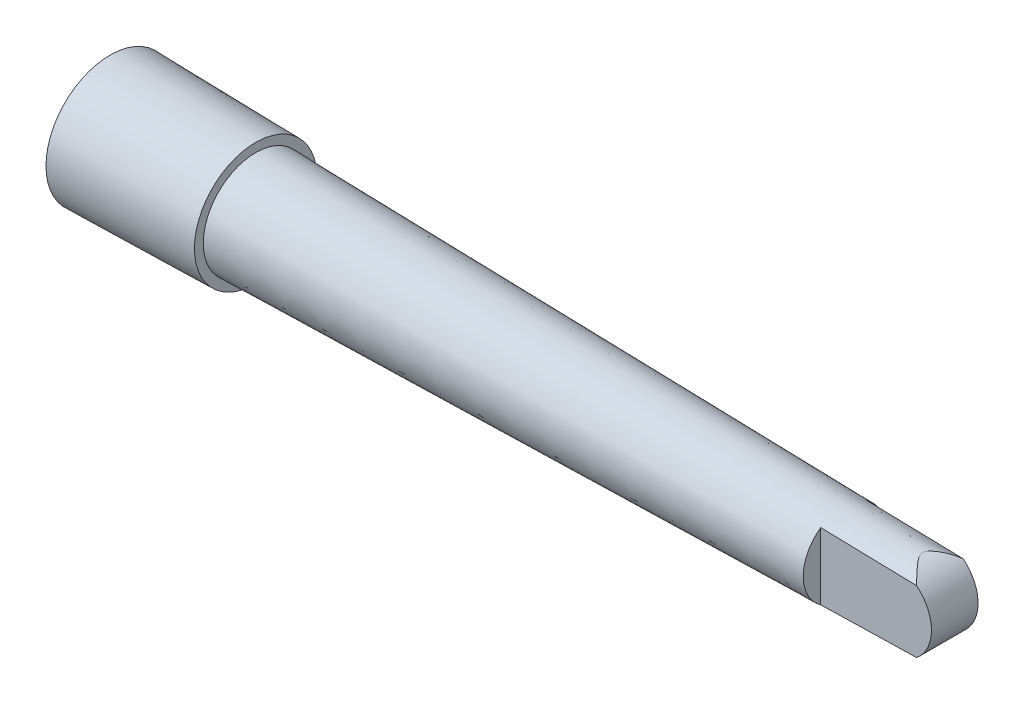
ISO-10303-21;
HEADER;
FILE_DESCRIPTION(('STEP AP214'),'2;1');
FILE_NAME('part.step','',(''),(''),'','','');
FILE_SCHEMA(('AUTOMOTIVE_DESIGN { 1 0 10303 214 1 1 1 1 }'));
ENDSEC;
DATA;
#1=APPLICATION_CONTEXT('core data for automotive mechanical design processes');
#2=APPLICATION_PROTOCOL_DEFINITION('international standard','automotive_design',2000,#1);
#3=PRODUCT_CONTEXT('',#1,'mechanical');
#4=PRODUCT('Part','Part','',(#3));
#5=PRODUCT_RELATED_PRODUCT_CATEGORY('part','',(#4));
#6=PRODUCT_DEFINITION_FORMATION('','',#4);
#7=PRODUCT_DEFINITION_CONTEXT('part definition',#1,'design');
#8=PRODUCT_DEFINITION('design','',#6,#7);
#9=PRODUCT_DEFINITION_SHAPE('','',#8);
#10=(LENGTH_UNIT() NAMED_UNIT(*) SI_UNIT(.MILLI.,.METRE.));
#11=(NAMED_UNIT(*) PLANE_ANGLE_UNIT() SI_UNIT($,.RADIAN.));
#12=(NAMED_UNIT(*) SI_UNIT($,.STERADIAN.) SOLID_ANGLE_UNIT());
#13=UNCERTAINTY_MEASURE_WITH_UNIT(LENGTH_MEASURE(1.E-05),#10,'distance_accuracy_value','');
#14=(GEOMETRIC_REPRESENTATION_CONTEXT(3) GLOBAL_UNCERTAINTY_ASSIGNED_CONTEXT((#13)) GLOBAL_UNIT_ASSIGNED_CONTEXT((#10,
#11,#12)) REPRESENTATION_CONTEXT('',''));
#15=CARTESIAN_POINT('',(0.,0.,0.));
#16=DIRECTION('',(0.,0.,1.));
#17=DIRECTION('',(1.,0.,0.));
#18=AXIS2_PLACEMENT_3D('',#15,#16,#17);
#19=CARTESIAN_POINT('',(34.53891081246,0.,1.));
#20=DIRECTION('',(0.,0.,-1.));
#21=DIRECTION('',(-1.,0.,0.));
#22=AXIS2_PLACEMENT_3D('',#19,#20,#21);
#23=CYLINDRICAL_SURFACE('',#22,1.71381266168101);
#24=CARTESIAN_POINT('',(35.6129098589705,1.33554479050034,1.0002));
#25=CARTESIAN_POINT('',(35.5710754093212,1.36919062556842,0.956614483907782));
#26=CARTESIAN_POINT('',(35.5283537615968,1.40030634566308,0.911972795537945));
#27=CARTESIAN_POINT('',(35.4417156894242,1.45766732781688,0.820693518239143));
#28=CARTESIAN_POINT('',(35.3977985668301,1.4839096707341,0.774054753514446));
#29=CARTESIAN_POINT('',(35.3092679079826,1.53174558296436,0.678807433866155));
#30=CARTESIAN_POINT('',(35.2646526771293,1.55332496296612,0.630193386926654));
#31=CARTESIAN_POINT('',(35.1757037388893,1.59184821556085,0.53095103685445));
#32=CARTESIAN_POINT('',(35.131369855831,1.60879533225182,0.480324171960923));
#33=CARTESIAN_POINT('',(35.063473306734,1.63176892422619,0.398474936995456));
#34=CARTESIAN_POINT('',(35.0391871385938,1.63935547971977,0.368284536236318));
#35=CARTESIAN_POINT('',(34.992060431569,1.65299843700725,0.306373187031664));
#36=CARTESIAN_POINT('',(34.9692210082719,1.65905366850583,0.274651089922352));
#37=CARTESIAN_POINT('',(34.9339233308981,1.66773280757409,0.219748420933613));
#38=CARTESIAN_POINT('',(34.9205424554692,1.67082767945205,0.197245493724769));
#39=CARTESIAN_POINT('',(34.8964783736258,1.67614108434504,0.150732899940423));
#40=CARTESIAN_POINT('',(34.885787015779,1.67836227714266,0.126728068439589));
#41=CARTESIAN_POINT('',(34.8720217201547,1.68113761877454,0.0854390842627665));
#42=CARTESIAN_POINT('',(34.8675937600339,1.68200180191774,0.0686454268782642));
#43=CARTESIAN_POINT('',(34.8615856588943,1.68316511486136,0.0345531090299951));
#44=CARTESIAN_POINT('',(34.8599976165166,1.68346581253088,0.0172559862150024));
#45=CARTESIAN_POINT('',(34.8600023972365,1.68346487787759,-0.0173953252603501));
#46=CARTESIAN_POINT('',(34.8616057710572,1.68316124766568,-0.034749513215745));
#47=CARTESIAN_POINT('',(34.8676613326472,1.6819886959643,-0.0689446489158741));
#48=CARTESIAN_POINT('',(34.8721206167356,1.68111836625907,-0.0857842084108123));
#49=CARTESIAN_POINT('',(34.8870768808451,1.67810105229128,-0.130511061539349));
#50=CARTESIAN_POINT('',(34.8996102641406,1.67548612138437,-0.1576568570613));
#51=CARTESIAN_POINT('',(34.927873045552,1.66915478244201,-0.21013634767005));
#52=CARTESIAN_POINT('',(34.9436207279275,1.66543201446147,-0.235458501449856));
#53=CARTESIAN_POINT('',(34.9931273952503,1.65287029178607,-0.309370873557652));
#54=CARTESIAN_POINT('',(35.029249223681,1.64262083293091,-0.356108818798224));
#55=CARTESIAN_POINT('',(35.1033821698874,1.61866601064454,-0.447181444942085));
#56=CARTESIAN_POINT('',(35.1413976514937,1.60495233740392,-0.491510031176772));
#57=CARTESIAN_POINT('',(35.2179906324063,1.57407302469039,-0.57850019648314));
#58=CARTESIAN_POINT('',(35.2565683498366,1.55690601051195,-0.621161103582338));
#59=CARTESIAN_POINT('',(35.3334917245639,1.51908979930087,-0.705018298709478));
#60=CARTESIAN_POINT('',(35.3718376023505,1.49844474450497,-0.746216259209671));
#61=CARTESIAN_POINT('',(35.4444719564534,1.45558485586137,-0.823571562907206));
#62=CARTESIAN_POINT('',(35.4788147264644,1.43367902982625,-0.859848631999536));
#63=CARTESIAN_POINT('',(35.5465864692199,1.38687928180383,-0.93103780288313));
#64=CARTESIAN_POINT('',(35.5800180207354,1.36199517440583,-0.965953911360827));
#65=CARTESIAN_POINT('',(35.6129098589705,1.33554479050034,-1.0002));
#66=B_SPLINE_CURVE_WITH_KNOTS('',3,(#24,#25,#26,#27,#28,#29,#30,#31,#32,#33,#34,#35,#36,#37,#38,
#39,#40,#41,#42,#43,#44,#45,#46,#47,#48,#49,#50,#51,#52,#53,#54,#55,#56,#57,#58,#59,#60,#61,#62,
#63,#64,#65),.UNSPECIFIED.,.F.,.F.,(4,2,2,2,2,2,2,2,2,2,2,2,2,2,2,2,2,2,2,2,4),(0.,
0.207352947565511,0.414829701257062,0.622929179157062,0.830882543830451,0.949286928779782,
1.06778153119735,1.14677659539275,1.22552927455417,1.27750138874248,1.32932867725505,
1.38132758976482,1.43345621227284,1.52298369100452,1.61303538982849,1.79247034183218,
1.97233987121023,2.15228114522978,2.33200961055955,2.49554542593278,2.65855644388926),.UNSPECIFIED.);
#67=CARTESIAN_POINT('',(35.6127176913632,1.33569930229763,0.999999999999999));
#68=VERTEX_POINT('',#67);
#69=CARTESIAN_POINT('',(35.6127176913632,1.33569930229763,-1.));
#70=VERTEX_POINT('',#69);
#71=EDGE_CURVE('E56',#68,#70,#66,.T.);
#72=ORIENTED_EDGE('',*,*,#71,.F.);
#73=CARTESIAN_POINT('',(34.53891081246,0.,1.));
#74=DIRECTION('',(0.,0.,1.));
#75=DIRECTION('',(-1.,0.,0.));
#76=AXIS2_PLACEMENT_3D('',#73,#74,#75);
#77=CIRCLE('',#76,1.71381266168101);
#78=CARTESIAN_POINT('',(35.6127176913631,-1.33569930229776,1.));
#79=VERTEX_POINT('',#78);
#80=EDGE_CURVE('E97',#79,#68,#77,.T.);
#81=ORIENTED_EDGE('',*,*,#80,.F.);
#82=CARTESIAN_POINT('',(35.6129098589705,-1.33554479050034,-1.0002));
#83=CARTESIAN_POINT('',(35.5710754093212,-1.36919062556842,-0.956614483907782));
#84=CARTESIAN_POINT('',(35.5283537615968,-1.40030634566308,-0.911972795537945));
#85=CARTESIAN_POINT('',(35.4417156894242,-1.45766732781688,-0.820693518239144));
#86=CARTESIAN_POINT('',(35.3977985668301,-1.4839096707341,-0.774054753514448));
#87=CARTESIAN_POINT('',(35.3092679079826,-1.53174558296436,-0.678807433866156));
#88=CARTESIAN_POINT('',(35.2646526771293,-1.55332496296612,-0.630193386926655));
#89=CARTESIAN_POINT('',(35.1757037388893,-1.59184821556085,-0.530951036854452));
#90=CARTESIAN_POINT('',(35.131369855831,-1.60879533225182,-0.480324171960926));
#91=CARTESIAN_POINT('',(35.063473306734,-1.63176892422619,-0.398474936995459));
#92=CARTESIAN_POINT('',(35.0391871385938,-1.63935547971977,-0.36828453623632));
#93=CARTESIAN_POINT('',(34.992060431569,-1.65299843700725,-0.306373187031665));
#94=CARTESIAN_POINT('',(34.9692210082719,-1.65905366850583,-0.274651089922352));
#95=CARTESIAN_POINT('',(34.9339233308981,-1.66773280757409,-0.219748420933614));
#96=CARTESIAN_POINT('',(34.9205424554692,-1.67082767945205,-0.197245493724771));
#97=CARTESIAN_POINT('',(34.8964783736258,-1.67614108434504,-0.150732899940424));
#98=CARTESIAN_POINT('',(34.885787015779,-1.67836227714266,-0.126728068439588));
#99=CARTESIAN_POINT('',(34.8720217201547,-1.68113761877454,-0.0854390842627642));
#100=CARTESIAN_POINT('',(34.8675937600339,-1.68200180191774,-0.0686454268782618));
#101=CARTESIAN_POINT('',(34.8615856588943,-1.68316511486136,-0.0345531090299926));
#102=CARTESIAN_POINT('',(34.8599976165166,-1.68346581253088,-0.017255986215));
#103=CARTESIAN_POINT('',(34.8600023972365,-1.68346487787759,0.0173953252603517));
#104=CARTESIAN_POINT('',(34.8616057710571,-1.68316124766568,0.034749513215746));
#105=CARTESIAN_POINT('',(34.8676613326472,-1.6819886959643,0.0689446489158752));
#106=CARTESIAN_POINT('',(34.8721206167356,-1.68111836625907,0.0857842084108142));
#107=CARTESIAN_POINT('',(34.887076880845,-1.67810105229128,0.130511061539353));
#108=CARTESIAN_POINT('',(34.8996102641406,-1.67548612138437,0.157656857061304));
#109=CARTESIAN_POINT('',(34.927873045552,-1.66915478244201,0.210136347670054));
#110=CARTESIAN_POINT('',(34.9436207279275,-1.66543201446147,0.235458501449862));
#111=CARTESIAN_POINT('',(34.9931273952503,-1.65287029178607,0.309370873557662));
#112=CARTESIAN_POINT('',(35.029249223681,-1.6426208329309,0.356108818798234));
#113=CARTESIAN_POINT('',(35.1033821698874,-1.61866601064454,0.447181444942096));
#114=CARTESIAN_POINT('',(35.1413976514937,-1.60495233740391,0.491510031176785));
#115=CARTESIAN_POINT('',(35.2179906324063,-1.57407302469038,0.578500196483159));
#116=CARTESIAN_POINT('',(35.2565683498367,-1.55690601051194,0.621161103582361));
#117=CARTESIAN_POINT('',(35.3334917245639,-1.51908979930086,0.705018298709502));
#118=CARTESIAN_POINT('',(35.3718376023505,-1.49844474450496,0.746216259209694));
#119=CARTESIAN_POINT('',(35.4444719564534,-1.45558485586136,0.823571562907225));
#120=CARTESIAN_POINT('',(35.4788147264645,-1.43367902982624,0.859848631999552));
#121=CARTESIAN_POINT('',(35.5465864692199,-1.38687928180383,0.931037802883139));
#122=CARTESIAN_POINT('',(35.5800180207354,-1.36199517440582,0.965953911360832));
#123=CARTESIAN_POINT('',(35.6129098589705,-1.33554479050034,1.0002));
#124=B_SPLINE_CURVE_WITH_KNOTS('',3,(#82,#83,#84,#85,#86,#87,#88,#89,#90,#91,#92,#93,#94,#95,
#96,#97,#98,#99,#100,#101,#102,#103,#104,#105,#106,#107,#108,#109,#110,#111,#112,#113,#114,#115,
#116,#117,#118,#119,#120,#121,#122,#123),.UNSPECIFIED.,.F.,.F.,(4,2,2,2,2,2,2,2,2,2,2,2,2,2,2,2,
2,2,2,2,4),(0.,0.20735294756551,0.414829701257061,0.622929179157055,0.83088254383045,
0.949286928779781,1.06778153119735,1.14677659539274,1.22552927455417,1.27750138874248,
1.32932867725505,1.38132758976482,1.43345621227284,1.52298369100453,1.61303538982849,
1.7924703418322,1.97233987121026,2.15228114522982,2.33200961055959,2.4955454259328,
2.65855644388927),.UNSPECIFIED.);
#125=CARTESIAN_POINT('',(35.6127176913631,-1.33569930229776,-1.));
#126=VERTEX_POINT('',#125);
#127=EDGE_CURVE('E85',#126,#79,#124,.T.);
#128=ORIENTED_EDGE('',*,*,#127,.F.);
#129=CARTESIAN_POINT('',(34.53891081246,0.,-1.));
#130=DIRECTION('',(0.,0.,1.));
#131=DIRECTION('',(-1.,0.,0.));
#132=AXIS2_PLACEMENT_3D('',#129,#130,#131);
#133=CIRCLE('',#132,1.71381266168101);
#134=EDGE_CURVE('E90',#126,#70,#133,.T.);
#135=ORIENTED_EDGE('',*,*,#134,.T.);
#136=EDGE_LOOP('',(#72,#81,#128,#135));
#137=FACE_BOUND('',#136,.T.);
#138=ADVANCED_FACE('F35',(#137),#23,.T.);
#139=CARTESIAN_POINT('',(34.53891081246,0.,1.));
#140=DIRECTION('',(0.,0.,-1.));
#141=DIRECTION('',(-1.,0.,0.));
#142=AXIS2_PLACEMENT_3D('',#139,#140,#141);
#143=PLANE('',#142);
#144=CARTESIAN_POINT('',(28.688914113769,-1.50347142785602,1.));
#145=CARTESIAN_POINT('',(29.8248844813336,-1.47645283149298,1.));
#146=CARTESIAN_POINT('',(30.9608496812903,-1.44921693552659,1.));
#147=CARTESIAN_POINT('',(33.2327672535008,-1.39421528753617,1.));
#148=CARTESIAN_POINT('',(34.3687196257546,-1.36644953550879,1.));
#149=CARTESIAN_POINT('',(37.3786953566516,-1.29204888359884,1.));
#150=CARTESIAN_POINT('',(39.25270551461,-1.24487585768188,1.));
#151=CARTESIAN_POINT('',(42.0636752017256,-1.17233122470094,1.));
#152=CARTESIAN_POINT('',(43.0006577525966,-1.14785215800662,1.));
#153=CARTESIAN_POINT('',(44.8746035863444,-1.09816174940605,1.));
#154=CARTESIAN_POINT('',(45.8115668692177,-1.07295040736917,1.));
#155=CARTESIAN_POINT('',(46.7485183908827,-1.0473043082591,1.));
#156=B_SPLINE_CURVE_WITH_KNOTS('',3,(#144,#145,#146,#147,#148,#149,#150,#151,#152,#153,#154,
#155),.UNSPECIFIED.,.F.,.F.,(4,2,2,2,2,4),(0.,3.40887486317189,6.81774974787121,
12.4415598412191,15.2534663692512,18.0653733988342),.UNSPECIFIED.);
#157=CARTESIAN_POINT('',(31.5,-1.43614066163451,1.));
#158=VERTEX_POINT('',#157);
#159=EDGE_CURVE('E80',#79,#158,#156,.F.);
#160=ORIENTED_EDGE('',*,*,#159,.F.);
#161=ORIENTED_EDGE('',*,*,#80,.T.);
#162=CARTESIAN_POINT('',(28.688914113769,1.50347142785602,1.));
#163=CARTESIAN_POINT('',(29.8248844813336,1.47645283149298,1.));
#164=CARTESIAN_POINT('',(30.9608496812903,1.44921693552659,1.));
#165=CARTESIAN_POINT('',(33.2327672535008,1.39421528753617,1.));
#166=CARTESIAN_POINT('',(34.3687196257546,1.36644953550879,1.));
#167=CARTESIAN_POINT('',(37.3786953566516,1.29204888359884,1.));
#168=CARTESIAN_POINT('',(39.25270551461,1.24487585768188,1.));
#169=CARTESIAN_POINT('',(42.0636752017256,1.17233122470094,1.));
#170=CARTESIAN_POINT('',(43.0006577525966,1.14785215800662,1.));
#171=CARTESIAN_POINT('',(44.8746035863444,1.09816174940605,1.));
#172=CARTESIAN_POINT('',(45.8115668692177,1.07295040736917,1.));
#173=CARTESIAN_POINT('',(46.7485183908827,1.0473043082591,1.));
#174=B_SPLINE_CURVE_WITH_KNOTS('',3,(#162,#163,#164,#165,#166,#167,#168,#169,#170,#171,#172,
#173),.UNSPECIFIED.,.F.,.F.,(4,2,2,2,2,4),(0.,3.40887486317189,6.81774974787121,
12.4415598412191,15.2534663692512,18.0653733988342),.UNSPECIFIED.);
#175=CARTESIAN_POINT('',(31.5,1.43614066163451,1.));
#176=VERTEX_POINT('',#175);
#177=EDGE_CURVE('E100',#176,#68,#174,.T.);
#178=ORIENTED_EDGE('',*,*,#177,.F.);
#179=DIRECTION('',(0.,-1.,0.));
#180=VECTOR('',#179,1.);
#181=CARTESIAN_POINT('',(31.5,1.75,1.));
#182=LINE('',#181,#180);
#183=EDGE_CURVE('E95',#176,#158,#182,.T.);
#184=ORIENTED_EDGE('',*,*,#183,.T.);
#185=EDGE_LOOP('',(#160,#161,#178,#184));
#186=FACE_BOUND('',#185,.T.);
#187=ADVANCED_FACE('F99',(#186),#143,.F.);
#188=CARTESIAN_POINT('',(34.53891081246,0.,-1.));
#189=DIRECTION('',(0.,0.,-1.));
#190=DIRECTION('',(-1.,0.,0.));
#191=AXIS2_PLACEMENT_3D('',#188,#189,#190);
#192=PLANE('',#191);
#193=ORIENTED_EDGE('',*,*,#134,.F.);
#194=CARTESIAN_POINT('',(28.688914113769,-1.50347142785602,-1.));
#195=CARTESIAN_POINT('',(29.8248844813336,-1.47645283149298,-1.));
#196=CARTESIAN_POINT('',(30.9608496812903,-1.44921693552659,-1.));
#197=CARTESIAN_POINT('',(33.2327672535008,-1.39421528753617,-1.));
#198=CARTESIAN_POINT('',(34.3687196257546,-1.36644953550879,-1.));
#199=CARTESIAN_POINT('',(37.3786953566516,-1.29204888359884,-1.));
#200=CARTESIAN_POINT('',(39.25270551461,-1.24487585768188,-1.));
#201=CARTESIAN_POINT('',(42.0636752017256,-1.17233122470094,-1.));
#202=CARTESIAN_POINT('',(43.0006577525966,-1.14785215800662,-1.));
#203=CARTESIAN_POINT('',(44.8746035863444,-1.09816174940605,-1.));
#204=CARTESIAN_POINT('',(45.8115668692177,-1.07295040736917,-1.));
#205=CARTESIAN_POINT('',(46.7485183908827,-1.0473043082591,-1.));
#206=B_SPLINE_CURVE_WITH_KNOTS('',3,(#194,#195,#196,#197,#198,#199,#200,#201,#202,#203,#204,
#205),.UNSPECIFIED.,.F.,.F.,(4,2,2,2,2,4),(0.,3.40887486317189,6.81774974787121,
12.4415598412191,15.2534663692512,18.0653733988342),.UNSPECIFIED.);
#207=CARTESIAN_POINT('',(31.5,-1.43614066163451,-1.));
#208=VERTEX_POINT('',#207);
#209=EDGE_CURVE('E11',#126,#208,#206,.F.);
#210=ORIENTED_EDGE('',*,*,#209,.T.);
#211=DIRECTION('',(0.,-1.,0.));
#212=VECTOR('',#211,1.);
#213=CARTESIAN_POINT('',(31.5,1.75,-1.));
#214=LINE('',#213,#212);
#215=CARTESIAN_POINT('',(31.5,1.43614066163451,-1.));
#216=VERTEX_POINT('',#215);
#217=EDGE_CURVE('E101',#216,#208,#214,.T.);
#218=ORIENTED_EDGE('',*,*,#217,.F.);
#219=CARTESIAN_POINT('',(28.688914113769,1.50347142785602,-1.));
#220=CARTESIAN_POINT('',(29.8248844813336,1.47645283149298,-1.));
#221=CARTESIAN_POINT('',(30.9608496812903,1.44921693552659,-1.));
#222=CARTESIAN_POINT('',(33.2327672535008,1.39421528753617,-1.));
#223=CARTESIAN_POINT('',(34.3687196257546,1.36644953550879,-1.));
#224=CARTESIAN_POINT('',(37.3786953566516,1.29204888359884,-1.));
#225=CARTESIAN_POINT('',(39.25270551461,1.24487585768188,-1.));
#226=CARTESIAN_POINT('',(42.0636752017256,1.17233122470094,-1.));
#227=CARTESIAN_POINT('',(43.0006577525966,1.14785215800662,-1.));
#228=CARTESIAN_POINT('',(44.8746035863444,1.09816174940605,-1.));
#229=CARTESIAN_POINT('',(45.8115668692177,1.07295040736917,-1.));
#230=CARTESIAN_POINT('',(46.7485183908827,1.0473043082591,-1.));
#231=B_SPLINE_CURVE_WITH_KNOTS('',3,(#219,#220,#221,#222,#223,#224,#225,#226,#227,#228,#229,
#230),.UNSPECIFIED.,.F.,.F.,(4,2,2,2,2,4),(0.,3.40887486317189,6.81774974787121,
12.4415598412191,15.2534663692512,18.0653733988342),.UNSPECIFIED.);
#232=EDGE_CURVE('E49',#216,#70,#231,.T.);
#233=ORIENTED_EDGE('',*,*,#232,.T.);
#234=EDGE_LOOP('',(#193,#210,#218,#233));
#235=FACE_BOUND('',#234,.T.);
#236=ADVANCED_FACE('F126',(#235),#192,.T.);
#237=CARTESIAN_POINT('',(31.5,1.75,0.));
#238=DIRECTION('',(-1.,0.,0.));
#239=DIRECTION('',(0.,0.,1.));
#240=AXIS2_PLACEMENT_3D('',#237,#238,#239);
#241=PLANE('',#240);
#242=ORIENTED_EDGE('',*,*,#183,.F.);
#243=CARTESIAN_POINT('',(31.5,0.,0.));
#244=DIRECTION('',(-1.,0.,0.));
#245=DIRECTION('',(0.,0.,1.));
#246=AXIS2_PLACEMENT_3D('',#243,#244,#245);
#247=CIRCLE('',#246,1.75);
#248=EDGE_CURVE('E83',#158,#176,#247,.T.);
#249=ORIENTED_EDGE('',*,*,#248,.F.);
#250=EDGE_LOOP('',(#242,#249));
#251=FACE_BOUND('',#250,.T.);
#252=ADVANCED_FACE('F94',(#251),#241,.F.);
#253=CARTESIAN_POINT('',(0.,0.,0.));
#254=DIRECTION('',(1.,0.,0.));
#255=DIRECTION('',(0.,0.,-1.));
#256=AXIS2_PLACEMENT_3D('',#253,#254,#255);
#257=PLANE('',#256);
#258=CARTESIAN_POINT('',(0.,0.,0.));
#259=DIRECTION('',(-1.,0.,0.));
#260=DIRECTION('',(0.,0.,1.));
#261=AXIS2_PLACEMENT_3D('',#258,#259,#260);
#262=CIRCLE('',#261,2.75);
#263=CARTESIAN_POINT('',(0.,0.,2.75));
#264=VERTEX_POINT('',#263);
#265=EDGE_CURVE('E102',#264,#264,#262,.T.);
#266=ORIENTED_EDGE('',*,*,#265,.T.);
#267=EDGE_LOOP('',(#266));
#268=FACE_BOUND('',#267,.T.);
#269=ADVANCED_FACE('F37',(#268),#257,.F.);
#270=CARTESIAN_POINT('',(6.25,0.,0.));
#271=DIRECTION('',(-1.,0.,0.));
#272=DIRECTION('',(0.,0.,1.));
#273=AXIS2_PLACEMENT_3D('',#270,#271,#272);
#274=CONICAL_SURFACE('',#273,2.63,0.0191976412257011);
#275=ORIENTED_EDGE('',*,*,#265,.F.);
#276=EDGE_LOOP('',(#275));
#277=FACE_BOUND('',#276,.T.);
#278=CARTESIAN_POINT('',(6.25,0.,0.));
#279=DIRECTION('',(-1.,0.,0.));
#280=DIRECTION('',(0.,0.,1.));
#281=AXIS2_PLACEMENT_3D('',#278,#279,#280);
#282=CIRCLE('',#281,2.63);
#283=CARTESIAN_POINT('',(6.25,0.,2.63));
#284=VERTEX_POINT('',#283);
#285=EDGE_CURVE('E106',#284,#284,#282,.T.);
#286=ORIENTED_EDGE('',*,*,#285,.T.);
#287=EDGE_LOOP('',(#286));
#288=FACE_BOUND('',#287,.T.);
#289=ADVANCED_FACE('F164',(#277,#288),#274,.T.);
#290=CARTESIAN_POINT('',(6.25,2.63,0.));
#291=DIRECTION('',(-1.,0.,0.));
#292=DIRECTION('',(0.,0.,1.));
#293=AXIS2_PLACEMENT_3D('',#290,#291,#292);
#294=PLANE('',#293);
#295=ORIENTED_EDGE('',*,*,#285,.F.);
#296=EDGE_LOOP('',(#295));
#297=FACE_BOUND('',#296,.T.);
#298=CARTESIAN_POINT('',(6.25,0.,0.));
#299=DIRECTION('',(-1.,0.,0.));
#300=DIRECTION('',(0.,0.,1.));
#301=AXIS2_PLACEMENT_3D('',#298,#299,#300);
#302=CIRCLE('',#301,2.25);
#303=CARTESIAN_POINT('',(6.25,0.,2.25));
#304=VERTEX_POINT('',#303);
#305=EDGE_CURVE('E118',#304,#304,#302,.T.);
#306=ORIENTED_EDGE('',*,*,#305,.T.);
#307=EDGE_LOOP('',(#306));
#308=FACE_BOUND('',#307,.T.);
#309=ADVANCED_FACE('F161',(#297,#308),#294,.F.);
#310=CARTESIAN_POINT('',(31.5,0.,0.));
#311=DIRECTION('',(-1.,0.,0.));
#312=DIRECTION('',(0.,0.,1.));
#313=AXIS2_PLACEMENT_3D('',#310,#311,#312);
#314=CONICAL_SURFACE('',#313,1.75,0.0197993925663929);
#315=ORIENTED_EDGE('',*,*,#305,.F.);
#316=EDGE_LOOP('',(#315));
#317=FACE_BOUND('',#316,.T.);
#318=ORIENTED_EDGE('',*,*,#248,.T.);
#319=ORIENTED_EDGE('',*,*,#177,.T.);
#320=ORIENTED_EDGE('',*,*,#71,.T.);
#321=ORIENTED_EDGE('',*,*,#232,.F.);
#322=EDGE_CURVE('E96',#216,#208,#247,.T.);
#323=ORIENTED_EDGE('',*,*,#322,.T.);
#324=ORIENTED_EDGE('',*,*,#209,.F.);
#325=ORIENTED_EDGE('',*,*,#127,.T.);
#326=ORIENTED_EDGE('',*,*,#159,.T.);
#327=EDGE_LOOP('',(#318,#319,#320,#321,#323,#324,#325,#326));
#328=FACE_BOUND('',#327,.T.);
#329=ADVANCED_FACE('F82',(#317,#328),#314,.T.);
#330=ORIENTED_EDGE('',*,*,#322,.F.);
#331=ORIENTED_EDGE('',*,*,#217,.T.);
#332=EDGE_LOOP('',(#330,#331));
#333=FACE_BOUND('',#332,.T.);
#334=ADVANCED_FACE('F154',(#333),#241,.F.);
#335=CLOSED_SHELL('',(#138,#187,#236,#252,#269,#289,#309,#329,#334));
#336=MANIFOLD_SOLID_BREP('B2',#335);
#337=ADVANCED_BREP_SHAPE_REPRESENTATION('',(#18,#336),#14);
#338=SHAPE_DEFINITION_REPRESENTATION(#9,#337);
ENDSEC;
END-ISO-10303-21;
